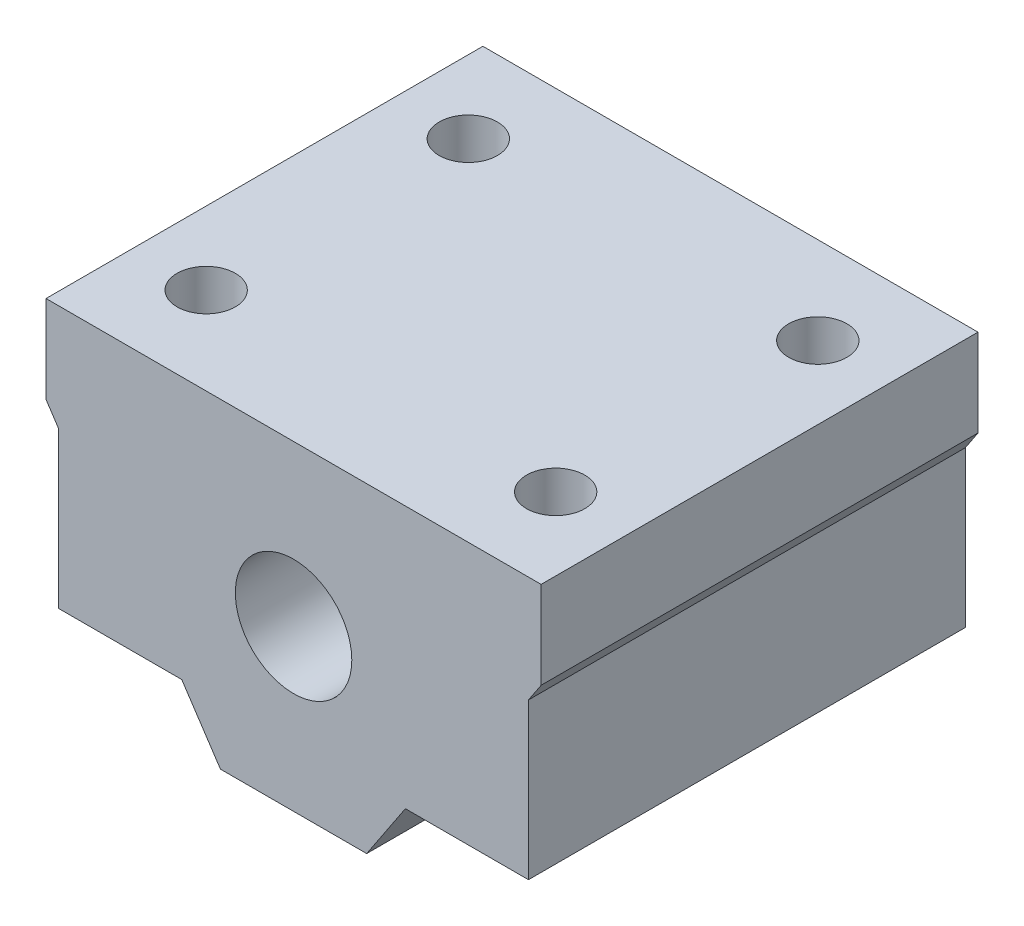
ISO-10303-21;
HEADER;
FILE_DESCRIPTION(('STEP AP214'),'2;1');
FILE_NAME('part.step','',(''),(''),'','','');
FILE_SCHEMA(('AUTOMOTIVE_DESIGN { 1 0 10303 214 1 1 1 1 }'));
ENDSEC;
DATA;
#1=APPLICATION_CONTEXT('core data for automotive mechanical design processes');
#2=APPLICATION_PROTOCOL_DEFINITION('international standard','automotive_design',2000,#1);
#3=PRODUCT_CONTEXT('',#1,'mechanical');
#4=PRODUCT('Part','Part','',(#3));
#5=PRODUCT_RELATED_PRODUCT_CATEGORY('part','',(#4));
#6=PRODUCT_DEFINITION_FORMATION('','',#4);
#7=PRODUCT_DEFINITION_CONTEXT('part definition',#1,'design');
#8=PRODUCT_DEFINITION('design','',#6,#7);
#9=PRODUCT_DEFINITION_SHAPE('','',#8);
#10=(LENGTH_UNIT() NAMED_UNIT(*) SI_UNIT(.MILLI.,.METRE.));
#11=(NAMED_UNIT(*) PLANE_ANGLE_UNIT() SI_UNIT($,.RADIAN.));
#12=(NAMED_UNIT(*) SI_UNIT($,.STERADIAN.) SOLID_ANGLE_UNIT());
#13=UNCERTAINTY_MEASURE_WITH_UNIT(LENGTH_MEASURE(1.E-05),#10,'distance_accuracy_value','');
#14=(GEOMETRIC_REPRESENTATION_CONTEXT(3) GLOBAL_UNCERTAINTY_ASSIGNED_CONTEXT((#13)) GLOBAL_UNIT_ASSIGNED_CONTEXT((#10,
#11,#12)) REPRESENTATION_CONTEXT('',''));
#15=CARTESIAN_POINT('',(0.,0.,0.));
#16=DIRECTION('',(0.,0.,1.));
#17=DIRECTION('',(1.,0.,0.));
#18=AXIS2_PLACEMENT_3D('',#15,#16,#17);
#19=CARTESIAN_POINT('',(0.,0.,30.));
#20=DIRECTION('',(0.,0.,1.));
#21=DIRECTION('',(1.,0.,0.));
#22=AXIS2_PLACEMENT_3D('',#19,#20,#21);
#23=PLANE('',#22);
#24=DIRECTION('',(0.553227534661274,0.833030188464145,0.));
#25=VECTOR('',#24,1.);
#26=CARTESIAN_POINT('',(7.67824556938152,-7.,30.));
#27=LINE('',#26,#25);
#28=CARTESIAN_POINT('',(5.02178705288402,-11.,30.));
#29=VERTEX_POINT('',#28);
#30=CARTESIAN_POINT('',(7.67824556938152,-7.,30.));
#31=VERTEX_POINT('',#30);
#32=EDGE_CURVE('E182',#29,#31,#27,.T.);
#33=ORIENTED_EDGE('',*,*,#32,.T.);
#34=DIRECTION('',(1.,0.,0.));
#35=VECTOR('',#34,1.);
#36=CARTESIAN_POINT('',(16.1308655391082,-7.,30.));
#37=LINE('',#36,#35);
#38=CARTESIAN_POINT('',(16.1308655391082,-7.,30.));
#39=VERTEX_POINT('',#38);
#40=EDGE_CURVE('E110',#31,#39,#37,.T.);
#41=ORIENTED_EDGE('',*,*,#40,.T.);
#42=DIRECTION('',(0.,1.,0.));
#43=VECTOR('',#42,1.);
#44=CARTESIAN_POINT('',(16.1308655391082,3.69128848729361,30.));
#45=LINE('',#44,#43);
#46=CARTESIAN_POINT('',(16.1308655391082,3.69128848729361,30.));
#47=VERTEX_POINT('',#46);
#48=EDGE_CURVE('E260',#39,#47,#45,.T.);
#49=ORIENTED_EDGE('',*,*,#48,.T.);
#50=DIRECTION('',(0.553227534661272,0.833030188464147,0.));
#51=VECTOR('',#50,1.);
#52=CARTESIAN_POINT('',(17.,5.,30.));
#53=LINE('',#52,#51);
#54=CARTESIAN_POINT('',(17.,5.,30.));
#55=VERTEX_POINT('',#54);
#56=EDGE_CURVE('E262',#47,#55,#53,.T.);
#57=ORIENTED_EDGE('',*,*,#56,.T.);
#58=DIRECTION('',(0.,1.,0.));
#59=VECTOR('',#58,1.);
#60=CARTESIAN_POINT('',(17.,11.,30.));
#61=LINE('',#60,#59);
#62=CARTESIAN_POINT('',(17.,11.,30.));
#63=VERTEX_POINT('',#62);
#64=EDGE_CURVE('E264',#55,#63,#61,.T.);
#65=ORIENTED_EDGE('',*,*,#64,.T.);
#66=DIRECTION('',(-1.,0.,0.));
#67=VECTOR('',#66,1.);
#68=CARTESIAN_POINT('',(17.,11.,30.));
#69=LINE('',#68,#67);
#70=CARTESIAN_POINT('',(-17.,11.,30.));
#71=VERTEX_POINT('',#70);
#72=EDGE_CURVE('E266',#63,#71,#69,.T.);
#73=ORIENTED_EDGE('',*,*,#72,.T.);
#74=DIRECTION('',(0.,-1.,0.));
#75=VECTOR('',#74,1.);
#76=CARTESIAN_POINT('',(-17.,11.,30.));
#77=LINE('',#76,#75);
#78=CARTESIAN_POINT('',(-17.,5.,30.));
#79=VERTEX_POINT('',#78);
#80=EDGE_CURVE('E268',#71,#79,#77,.T.);
#81=ORIENTED_EDGE('',*,*,#80,.T.);
#82=DIRECTION('',(0.553227534661274,-0.833030188464145,0.));
#83=VECTOR('',#82,1.);
#84=CARTESIAN_POINT('',(-17.,5.,30.));
#85=LINE('',#84,#83);
#86=CARTESIAN_POINT('',(-16.1308655391082,3.69128848729362,30.));
#87=VERTEX_POINT('',#86);
#88=EDGE_CURVE('E270',#79,#87,#85,.T.);
#89=ORIENTED_EDGE('',*,*,#88,.T.);
#90=DIRECTION('',(0.,-1.,0.));
#91=VECTOR('',#90,1.);
#92=CARTESIAN_POINT('',(-16.1308655391082,3.69128848729362,30.));
#93=LINE('',#92,#91);
#94=CARTESIAN_POINT('',(-16.1308655391082,-7.,30.));
#95=VERTEX_POINT('',#94);
#96=EDGE_CURVE('E141',#87,#95,#93,.T.);
#97=ORIENTED_EDGE('',*,*,#96,.T.);
#98=DIRECTION('',(1.,0.,0.));
#99=VECTOR('',#98,1.);
#100=CARTESIAN_POINT('',(-16.1308655391082,-7.,30.));
#101=LINE('',#100,#99);
#102=CARTESIAN_POINT('',(-7.67824556938152,-7.,30.));
#103=VERTEX_POINT('',#102);
#104=EDGE_CURVE('E135',#95,#103,#101,.T.);
#105=ORIENTED_EDGE('',*,*,#104,.T.);
#106=DIRECTION('',(0.553227534661274,-0.833030188464145,0.));
#107=VECTOR('',#106,1.);
#108=CARTESIAN_POINT('',(-7.67824556938152,-7.,30.));
#109=LINE('',#108,#107);
#110=CARTESIAN_POINT('',(-5.02178705288402,-11.,30.));
#111=VERTEX_POINT('',#110);
#112=EDGE_CURVE('E139',#103,#111,#109,.T.);
#113=ORIENTED_EDGE('',*,*,#112,.T.);
#114=DIRECTION('',(1.,0.,0.));
#115=VECTOR('',#114,1.);
#116=CARTESIAN_POINT('',(-5.02178705288402,-11.,30.));
#117=LINE('',#116,#115);
#118=EDGE_CURVE('E55',#111,#29,#117,.T.);
#119=ORIENTED_EDGE('',*,*,#118,.T.);
#120=EDGE_LOOP('',(#33,#41,#49,#57,#65,#73,#81,#89,#97,#105,#113,#119));
#121=FACE_BOUND('',#120,.T.);
#122=CARTESIAN_POINT('',(0.,0.,30.));
#123=DIRECTION('',(0.,0.,1.));
#124=DIRECTION('',(1.,0.,0.));
#125=AXIS2_PLACEMENT_3D('',#122,#123,#124);
#126=CIRCLE('',#125,4.);
#127=CARTESIAN_POINT('',(4.,0.,30.));
#128=VERTEX_POINT('',#127);
#129=EDGE_CURVE('E163',#128,#128,#126,.T.);
#130=ORIENTED_EDGE('',*,*,#129,.F.);
#131=EDGE_LOOP('',(#130));
#132=FACE_BOUND('',#131,.T.);
#133=ADVANCED_FACE('F36',(#121,#132),#23,.T.);
#134=CARTESIAN_POINT('',(0.,0.,0.));
#135=DIRECTION('',(0.,0.,1.));
#136=DIRECTION('',(1.,0.,0.));
#137=AXIS2_PLACEMENT_3D('',#134,#135,#136);
#138=PLANE('',#137);
#139=DIRECTION('',(0.553227534661274,0.833030188464145,0.));
#140=VECTOR('',#139,1.);
#141=CARTESIAN_POINT('',(7.67824556938152,-7.,0.));
#142=LINE('',#141,#140);
#143=CARTESIAN_POINT('',(5.02178705288402,-11.,0.));
#144=VERTEX_POINT('',#143);
#145=CARTESIAN_POINT('',(7.67824556938152,-7.,0.));
#146=VERTEX_POINT('',#145);
#147=EDGE_CURVE('E159',#144,#146,#142,.T.);
#148=ORIENTED_EDGE('',*,*,#147,.F.);
#149=DIRECTION('',(1.,0.,0.));
#150=VECTOR('',#149,1.);
#151=CARTESIAN_POINT('',(-5.02178705288402,-11.,0.));
#152=LINE('',#151,#150);
#153=CARTESIAN_POINT('',(-5.02178705288402,-11.,0.));
#154=VERTEX_POINT('',#153);
#155=EDGE_CURVE('E102',#154,#144,#152,.T.);
#156=ORIENTED_EDGE('',*,*,#155,.F.);
#157=DIRECTION('',(0.553227534661274,-0.833030188464145,0.));
#158=VECTOR('',#157,1.);
#159=CARTESIAN_POINT('',(-7.67824556938152,-7.,0.));
#160=LINE('',#159,#158);
#161=CARTESIAN_POINT('',(-7.67824556938152,-7.,0.));
#162=VERTEX_POINT('',#161);
#163=EDGE_CURVE('E96',#162,#154,#160,.T.);
#164=ORIENTED_EDGE('',*,*,#163,.F.);
#165=DIRECTION('',(1.,0.,0.));
#166=VECTOR('',#165,1.);
#167=CARTESIAN_POINT('',(-16.1308655391082,-7.,0.));
#168=LINE('',#167,#166);
#169=CARTESIAN_POINT('',(-16.1308655391082,-7.,0.));
#170=VERTEX_POINT('',#169);
#171=EDGE_CURVE('E149',#170,#162,#168,.T.);
#172=ORIENTED_EDGE('',*,*,#171,.F.);
#173=DIRECTION('',(0.,-1.,0.));
#174=VECTOR('',#173,1.);
#175=CARTESIAN_POINT('',(-16.1308655391082,3.69128848729362,0.));
#176=LINE('',#175,#174);
#177=CARTESIAN_POINT('',(-16.1308655391082,3.69128848729362,0.));
#178=VERTEX_POINT('',#177);
#179=EDGE_CURVE('E177',#178,#170,#176,.T.);
#180=ORIENTED_EDGE('',*,*,#179,.F.);
#181=DIRECTION('',(0.553227534661274,-0.833030188464145,0.));
#182=VECTOR('',#181,1.);
#183=CARTESIAN_POINT('',(-17.,5.,0.));
#184=LINE('',#183,#182);
#185=CARTESIAN_POINT('',(-17.,5.,0.));
#186=VERTEX_POINT('',#185);
#187=EDGE_CURVE('E175',#186,#178,#184,.T.);
#188=ORIENTED_EDGE('',*,*,#187,.F.);
#189=DIRECTION('',(0.,-1.,0.));
#190=VECTOR('',#189,1.);
#191=CARTESIAN_POINT('',(-17.,11.,0.));
#192=LINE('',#191,#190);
#193=CARTESIAN_POINT('',(-17.,11.,0.));
#194=VERTEX_POINT('',#193);
#195=EDGE_CURVE('E173',#194,#186,#192,.T.);
#196=ORIENTED_EDGE('',*,*,#195,.F.);
#197=DIRECTION('',(-1.,0.,0.));
#198=VECTOR('',#197,1.);
#199=CARTESIAN_POINT('',(17.,11.,0.));
#200=LINE('',#199,#198);
#201=CARTESIAN_POINT('',(17.,11.,0.));
#202=VERTEX_POINT('',#201);
#203=EDGE_CURVE('E171',#202,#194,#200,.T.);
#204=ORIENTED_EDGE('',*,*,#203,.F.);
#205=DIRECTION('',(0.,1.,0.));
#206=VECTOR('',#205,1.);
#207=CARTESIAN_POINT('',(17.,11.,0.));
#208=LINE('',#207,#206);
#209=CARTESIAN_POINT('',(17.,5.,0.));
#210=VERTEX_POINT('',#209);
#211=EDGE_CURVE('E169',#210,#202,#208,.T.);
#212=ORIENTED_EDGE('',*,*,#211,.F.);
#213=DIRECTION('',(0.553227534661272,0.833030188464147,0.));
#214=VECTOR('',#213,1.);
#215=CARTESIAN_POINT('',(17.,5.,0.));
#216=LINE('',#215,#214);
#217=CARTESIAN_POINT('',(16.1308655391082,3.69128848729361,0.));
#218=VERTEX_POINT('',#217);
#219=EDGE_CURVE('E167',#218,#210,#216,.T.);
#220=ORIENTED_EDGE('',*,*,#219,.F.);
#221=DIRECTION('',(0.,1.,0.));
#222=VECTOR('',#221,1.);
#223=CARTESIAN_POINT('',(16.1308655391082,3.69128848729361,0.));
#224=LINE('',#223,#222);
#225=CARTESIAN_POINT('',(16.1308655391082,-7.,0.));
#226=VERTEX_POINT('',#225);
#227=EDGE_CURVE('E165',#226,#218,#224,.T.);
#228=ORIENTED_EDGE('',*,*,#227,.F.);
#229=DIRECTION('',(1.,0.,0.));
#230=VECTOR('',#229,1.);
#231=CARTESIAN_POINT('',(16.1308655391082,-7.,0.));
#232=LINE('',#231,#230);
#233=EDGE_CURVE('E162',#146,#226,#232,.T.);
#234=ORIENTED_EDGE('',*,*,#233,.F.);
#235=EDGE_LOOP('',(#148,#156,#164,#172,#180,#188,#196,#204,#212,#220,#228,#234));
#236=FACE_BOUND('',#235,.T.);
#237=CARTESIAN_POINT('',(0.,0.,0.));
#238=DIRECTION('',(0.,0.,1.));
#239=DIRECTION('',(1.,0.,0.));
#240=AXIS2_PLACEMENT_3D('',#237,#238,#239);
#241=CIRCLE('',#240,4.);
#242=CARTESIAN_POINT('',(4.,0.,0.));
#243=VERTEX_POINT('',#242);
#244=EDGE_CURVE('E251',#243,#243,#241,.T.);
#245=ORIENTED_EDGE('',*,*,#244,.T.);
#246=EDGE_LOOP('',(#245));
#247=FACE_BOUND('',#246,.T.);
#248=ADVANCED_FACE('F283',(#236,#247),#138,.F.);
#249=CARTESIAN_POINT('',(7.67824556938152,-7.,30.));
#250=DIRECTION('',(-0.833030188464145,0.553227534661274,0.));
#251=DIRECTION('',(-0.553227534661274,-0.833030188464145,0.));
#252=AXIS2_PLACEMENT_3D('',#249,#250,#251);
#253=PLANE('',#252);
#254=ORIENTED_EDGE('',*,*,#147,.T.);
#255=DIRECTION('',(0.,0.,-1.));
#256=VECTOR('',#255,1.);
#257=CARTESIAN_POINT('',(7.67824556938152,-7.,30.));
#258=LINE('',#257,#256);
#259=EDGE_CURVE('E11',#31,#146,#258,.T.);
#260=ORIENTED_EDGE('',*,*,#259,.F.);
#261=ORIENTED_EDGE('',*,*,#32,.F.);
#262=DIRECTION('',(0.,0.,-1.));
#263=VECTOR('',#262,1.);
#264=CARTESIAN_POINT('',(5.02178705288402,-11.,30.));
#265=LINE('',#264,#263);
#266=EDGE_CURVE('E155',#29,#144,#265,.T.);
#267=ORIENTED_EDGE('',*,*,#266,.T.);
#268=EDGE_LOOP('',(#254,#260,#261,#267));
#269=FACE_BOUND('',#268,.T.);
#270=ADVANCED_FACE('F38',(#269),#253,.F.);
#271=CARTESIAN_POINT('',(16.1308655391082,-7.,30.));
#272=DIRECTION('',(0.,1.,0.));
#273=DIRECTION('',(0.,0.,1.));
#274=AXIS2_PLACEMENT_3D('',#271,#272,#273);
#275=PLANE('',#274);
#276=CARTESIAN_POINT('',(12.,-7.,6.));
#277=DIRECTION('',(0.,1.,0.));
#278=DIRECTION('',(0.,0.,1.));
#279=AXIS2_PLACEMENT_3D('',#276,#277,#278);
#280=CIRCLE('',#279,1.7);
#281=CARTESIAN_POINT('',(12.,-7.,7.7));
#282=VERTEX_POINT('',#281);
#283=EDGE_CURVE('E212',#282,#282,#280,.T.);
#284=ORIENTED_EDGE('',*,*,#283,.T.);
#285=EDGE_LOOP('',(#284));
#286=FACE_BOUND('',#285,.T.);
#287=CARTESIAN_POINT('',(12.,-7.,24.));
#288=DIRECTION('',(0.,1.,0.));
#289=DIRECTION('',(0.,0.,1.));
#290=AXIS2_PLACEMENT_3D('',#287,#288,#289);
#291=CIRCLE('',#290,1.7);
#292=CARTESIAN_POINT('',(12.,-7.,25.7));
#293=VERTEX_POINT('',#292);
#294=EDGE_CURVE('E209',#293,#293,#291,.T.);
#295=ORIENTED_EDGE('',*,*,#294,.T.);
#296=EDGE_LOOP('',(#295));
#297=FACE_BOUND('',#296,.T.);
#298=ORIENTED_EDGE('',*,*,#233,.T.);
#299=DIRECTION('',(0.,0.,-1.));
#300=VECTOR('',#299,1.);
#301=CARTESIAN_POINT('',(16.1308655391082,-7.,30.));
#302=LINE('',#301,#300);
#303=EDGE_CURVE('E46',#39,#226,#302,.T.);
#304=ORIENTED_EDGE('',*,*,#303,.F.);
#305=ORIENTED_EDGE('',*,*,#40,.F.);
#306=ORIENTED_EDGE('',*,*,#259,.T.);
#307=EDGE_LOOP('',(#298,#304,#305,#306));
#308=FACE_BOUND('',#307,.T.);
#309=ADVANCED_FACE('F360',(#286,#297,#308),#275,.F.);
#310=CARTESIAN_POINT('',(16.1308655391082,3.69128848729361,30.));
#311=DIRECTION('',(-1.,0.,0.));
#312=DIRECTION('',(0.,-1.,0.));
#313=AXIS2_PLACEMENT_3D('',#310,#311,#312);
#314=PLANE('',#313);
#315=ORIENTED_EDGE('',*,*,#227,.T.);
#316=DIRECTION('',(0.,0.,-1.));
#317=VECTOR('',#316,1.);
#318=CARTESIAN_POINT('',(16.1308655391082,3.69128848729361,30.));
#319=LINE('',#318,#317);
#320=EDGE_CURVE('E201',#47,#218,#319,.T.);
#321=ORIENTED_EDGE('',*,*,#320,.F.);
#322=ORIENTED_EDGE('',*,*,#48,.F.);
#323=ORIENTED_EDGE('',*,*,#303,.T.);
#324=EDGE_LOOP('',(#315,#321,#322,#323));
#325=FACE_BOUND('',#324,.T.);
#326=ADVANCED_FACE('F362',(#325),#314,.F.);
#327=CARTESIAN_POINT('',(17.,5.,30.));
#328=DIRECTION('',(-0.833030188464147,0.553227534661272,0.));
#329=DIRECTION('',(-0.553227534661272,-0.833030188464147,0.));
#330=AXIS2_PLACEMENT_3D('',#327,#328,#329);
#331=PLANE('',#330);
#332=ORIENTED_EDGE('',*,*,#219,.T.);
#333=DIRECTION('',(0.,0.,-1.));
#334=VECTOR('',#333,1.);
#335=CARTESIAN_POINT('',(17.,5.,30.));
#336=LINE('',#335,#334);
#337=EDGE_CURVE('E198',#55,#210,#336,.T.);
#338=ORIENTED_EDGE('',*,*,#337,.F.);
#339=ORIENTED_EDGE('',*,*,#56,.F.);
#340=ORIENTED_EDGE('',*,*,#320,.T.);
#341=EDGE_LOOP('',(#332,#338,#339,#340));
#342=FACE_BOUND('',#341,.T.);
#343=ADVANCED_FACE('F371',(#342),#331,.F.);
#344=CARTESIAN_POINT('',(17.,11.,30.));
#345=DIRECTION('',(-1.,0.,0.));
#346=DIRECTION('',(0.,0.,1.));
#347=AXIS2_PLACEMENT_3D('',#344,#345,#346);
#348=PLANE('',#347);
#349=ORIENTED_EDGE('',*,*,#211,.T.);
#350=DIRECTION('',(0.,0.,-1.));
#351=VECTOR('',#350,1.);
#352=CARTESIAN_POINT('',(17.,11.,30.));
#353=LINE('',#352,#351);
#354=EDGE_CURVE('E195',#63,#202,#353,.T.);
#355=ORIENTED_EDGE('',*,*,#354,.F.);
#356=ORIENTED_EDGE('',*,*,#64,.F.);
#357=ORIENTED_EDGE('',*,*,#337,.T.);
#358=EDGE_LOOP('',(#349,#355,#356,#357));
#359=FACE_BOUND('',#358,.T.);
#360=ADVANCED_FACE('F375',(#359),#348,.F.);
#361=CARTESIAN_POINT('',(17.,11.,30.));
#362=DIRECTION('',(0.,-1.,0.));
#363=DIRECTION('',(0.,0.,-1.));
#364=AXIS2_PLACEMENT_3D('',#361,#362,#363);
#365=PLANE('',#364);
#366=CARTESIAN_POINT('',(12.,11.,24.));
#367=DIRECTION('',(0.,1.,0.));
#368=DIRECTION('',(0.,0.,1.));
#369=AXIS2_PLACEMENT_3D('',#366,#367,#368);
#370=CIRCLE('',#369,2.);
#371=CARTESIAN_POINT('',(12.,11.,26.));
#372=VERTEX_POINT('',#371);
#373=EDGE_CURVE('E229',#372,#372,#370,.T.);
#374=ORIENTED_EDGE('',*,*,#373,.F.);
#375=EDGE_LOOP('',(#374));
#376=FACE_BOUND('',#375,.T.);
#377=CARTESIAN_POINT('',(12.,11.,6.));
#378=DIRECTION('',(0.,1.,0.));
#379=DIRECTION('',(0.,0.,1.));
#380=AXIS2_PLACEMENT_3D('',#377,#378,#379);
#381=CIRCLE('',#380,2.);
#382=CARTESIAN_POINT('',(12.,11.,8.));
#383=VERTEX_POINT('',#382);
#384=EDGE_CURVE('E240',#383,#383,#381,.T.);
#385=ORIENTED_EDGE('',*,*,#384,.F.);
#386=EDGE_LOOP('',(#385));
#387=FACE_BOUND('',#386,.T.);
#388=CARTESIAN_POINT('',(-12.,11.,6.));
#389=DIRECTION('',(0.,1.,0.));
#390=DIRECTION('',(0.,0.,1.));
#391=AXIS2_PLACEMENT_3D('',#388,#389,#390);
#392=CIRCLE('',#391,2.);
#393=CARTESIAN_POINT('',(-12.,11.,8.));
#394=VERTEX_POINT('',#393);
#395=EDGE_CURVE('E234',#394,#394,#392,.T.);
#396=ORIENTED_EDGE('',*,*,#395,.F.);
#397=EDGE_LOOP('',(#396));
#398=FACE_BOUND('',#397,.T.);
#399=CARTESIAN_POINT('',(-12.,11.,24.));
#400=DIRECTION('',(0.,1.,0.));
#401=DIRECTION('',(0.,0.,1.));
#402=AXIS2_PLACEMENT_3D('',#399,#400,#401);
#403=CIRCLE('',#402,2.);
#404=CARTESIAN_POINT('',(-12.,11.,26.));
#405=VERTEX_POINT('',#404);
#406=EDGE_CURVE('E233',#405,#405,#403,.T.);
#407=ORIENTED_EDGE('',*,*,#406,.F.);
#408=EDGE_LOOP('',(#407));
#409=FACE_BOUND('',#408,.T.);
#410=ORIENTED_EDGE('',*,*,#203,.T.);
#411=DIRECTION('',(0.,0.,-1.));
#412=VECTOR('',#411,1.);
#413=CARTESIAN_POINT('',(-17.,11.,30.));
#414=LINE('',#413,#412);
#415=EDGE_CURVE('E192',#71,#194,#414,.T.);
#416=ORIENTED_EDGE('',*,*,#415,.F.);
#417=ORIENTED_EDGE('',*,*,#72,.F.);
#418=ORIENTED_EDGE('',*,*,#354,.T.);
#419=EDGE_LOOP('',(#410,#416,#417,#418));
#420=FACE_BOUND('',#419,.T.);
#421=ADVANCED_FACE('F380',(#376,#387,#398,#409,#420),#365,.F.);
#422=CARTESIAN_POINT('',(-17.,11.,30.));
#423=DIRECTION('',(1.,0.,0.));
#424=DIRECTION('',(0.,0.,-1.));
#425=AXIS2_PLACEMENT_3D('',#422,#423,#424);
#426=PLANE('',#425);
#427=ORIENTED_EDGE('',*,*,#195,.T.);
#428=DIRECTION('',(0.,0.,-1.));
#429=VECTOR('',#428,1.);
#430=CARTESIAN_POINT('',(-17.,5.,30.));
#431=LINE('',#430,#429);
#432=EDGE_CURVE('E189',#79,#186,#431,.T.);
#433=ORIENTED_EDGE('',*,*,#432,.F.);
#434=ORIENTED_EDGE('',*,*,#80,.F.);
#435=ORIENTED_EDGE('',*,*,#415,.T.);
#436=EDGE_LOOP('',(#427,#433,#434,#435));
#437=FACE_BOUND('',#436,.T.);
#438=ADVANCED_FACE('F383',(#437),#426,.F.);
#439=CARTESIAN_POINT('',(-17.,5.,30.));
#440=DIRECTION('',(0.833030188464145,0.553227534661274,0.));
#441=DIRECTION('',(-0.553227534661274,0.833030188464145,0.));
#442=AXIS2_PLACEMENT_3D('',#439,#440,#441);
#443=PLANE('',#442);
#444=ORIENTED_EDGE('',*,*,#187,.T.);
#445=DIRECTION('',(0.,0.,-1.));
#446=VECTOR('',#445,1.);
#447=CARTESIAN_POINT('',(-16.1308655391082,3.69128848729362,30.));
#448=LINE('',#447,#446);
#449=EDGE_CURVE('E186',#87,#178,#448,.T.);
#450=ORIENTED_EDGE('',*,*,#449,.F.);
#451=ORIENTED_EDGE('',*,*,#88,.F.);
#452=ORIENTED_EDGE('',*,*,#432,.T.);
#453=EDGE_LOOP('',(#444,#450,#451,#452));
#454=FACE_BOUND('',#453,.T.);
#455=ADVANCED_FACE('F276',(#454),#443,.F.);
#456=CARTESIAN_POINT('',(-16.1308655391082,3.69128848729362,30.));
#457=DIRECTION('',(1.,0.,0.));
#458=DIRECTION('',(0.,0.,-1.));
#459=AXIS2_PLACEMENT_3D('',#456,#457,#458);
#460=PLANE('',#459);
#461=ORIENTED_EDGE('',*,*,#179,.T.);
#462=DIRECTION('',(0.,0.,-1.));
#463=VECTOR('',#462,1.);
#464=CARTESIAN_POINT('',(-16.1308655391082,-7.,30.));
#465=LINE('',#464,#463);
#466=EDGE_CURVE('E150',#95,#170,#465,.T.);
#467=ORIENTED_EDGE('',*,*,#466,.F.);
#468=ORIENTED_EDGE('',*,*,#96,.F.);
#469=ORIENTED_EDGE('',*,*,#449,.T.);
#470=EDGE_LOOP('',(#461,#467,#468,#469));
#471=FACE_BOUND('',#470,.T.);
#472=ADVANCED_FACE('F280',(#471),#460,.F.);
#473=CARTESIAN_POINT('',(-16.1308655391082,-7.,30.));
#474=DIRECTION('',(0.,1.,0.));
#475=DIRECTION('',(0.,0.,1.));
#476=AXIS2_PLACEMENT_3D('',#473,#474,#475);
#477=PLANE('',#476);
#478=CARTESIAN_POINT('',(-12.,-7.,24.));
#479=DIRECTION('',(0.,1.,0.));
#480=DIRECTION('',(0.,0.,1.));
#481=AXIS2_PLACEMENT_3D('',#478,#479,#480);
#482=CIRCLE('',#481,1.7);
#483=CARTESIAN_POINT('',(-12.,-7.,25.7));
#484=VERTEX_POINT('',#483);
#485=EDGE_CURVE('E226',#484,#484,#482,.T.);
#486=ORIENTED_EDGE('',*,*,#485,.T.);
#487=EDGE_LOOP('',(#486));
#488=FACE_BOUND('',#487,.T.);
#489=CARTESIAN_POINT('',(-12.,-7.,6.));
#490=DIRECTION('',(0.,1.,0.));
#491=DIRECTION('',(0.,0.,1.));
#492=AXIS2_PLACEMENT_3D('',#489,#490,#491);
#493=CIRCLE('',#492,1.7);
#494=CARTESIAN_POINT('',(-12.,-7.,7.7));
#495=VERTEX_POINT('',#494);
#496=EDGE_CURVE('E215',#495,#495,#493,.T.);
#497=ORIENTED_EDGE('',*,*,#496,.T.);
#498=EDGE_LOOP('',(#497));
#499=FACE_BOUND('',#498,.T.);
#500=ORIENTED_EDGE('',*,*,#171,.T.);
#501=DIRECTION('',(0.,0.,-1.));
#502=VECTOR('',#501,1.);
#503=CARTESIAN_POINT('',(-7.67824556938152,-7.,30.));
#504=LINE('',#503,#502);
#505=EDGE_CURVE('E146',#103,#162,#504,.T.);
#506=ORIENTED_EDGE('',*,*,#505,.F.);
#507=ORIENTED_EDGE('',*,*,#104,.F.);
#508=ORIENTED_EDGE('',*,*,#466,.T.);
#509=EDGE_LOOP('',(#500,#506,#507,#508));
#510=FACE_BOUND('',#509,.T.);
#511=ADVANCED_FACE('F147',(#488,#499,#510),#477,.F.);
#512=CARTESIAN_POINT('',(-7.67824556938152,-7.,30.));
#513=DIRECTION('',(0.833030188464145,0.553227534661274,0.));
#514=DIRECTION('',(-0.553227534661274,0.833030188464145,0.));
#515=AXIS2_PLACEMENT_3D('',#512,#513,#514);
#516=PLANE('',#515);
#517=ORIENTED_EDGE('',*,*,#163,.T.);
#518=DIRECTION('',(0.,0.,-1.));
#519=VECTOR('',#518,1.);
#520=CARTESIAN_POINT('',(-5.02178705288402,-11.,30.));
#521=LINE('',#520,#519);
#522=EDGE_CURVE('E151',#111,#154,#521,.T.);
#523=ORIENTED_EDGE('',*,*,#522,.F.);
#524=ORIENTED_EDGE('',*,*,#112,.F.);
#525=ORIENTED_EDGE('',*,*,#505,.T.);
#526=EDGE_LOOP('',(#517,#523,#524,#525));
#527=FACE_BOUND('',#526,.T.);
#528=ADVANCED_FACE('F153',(#527),#516,.F.);
#529=CARTESIAN_POINT('',(-5.02178705288402,-11.,30.));
#530=DIRECTION('',(0.,1.,0.));
#531=DIRECTION('',(0.,0.,1.));
#532=AXIS2_PLACEMENT_3D('',#529,#530,#531);
#533=PLANE('',#532);
#534=ORIENTED_EDGE('',*,*,#155,.T.);
#535=ORIENTED_EDGE('',*,*,#266,.F.);
#536=ORIENTED_EDGE('',*,*,#118,.F.);
#537=ORIENTED_EDGE('',*,*,#522,.T.);
#538=EDGE_LOOP('',(#534,#535,#536,#537));
#539=FACE_BOUND('',#538,.T.);
#540=ADVANCED_FACE('F289',(#539),#533,.F.);
#541=CARTESIAN_POINT('',(0.,0.,30.));
#542=DIRECTION('',(0.,0.,-1.));
#543=DIRECTION('',(-1.,0.,0.));
#544=AXIS2_PLACEMENT_3D('',#541,#542,#543);
#545=CYLINDRICAL_SURFACE('',#544,4.);
#546=ORIENTED_EDGE('',*,*,#129,.T.);
#547=EDGE_LOOP('',(#546));
#548=FACE_BOUND('',#547,.T.);
#549=ORIENTED_EDGE('',*,*,#244,.F.);
#550=EDGE_LOOP('',(#549));
#551=FACE_BOUND('',#550,.T.);
#552=ADVANCED_FACE('F291',(#548,#551),#545,.F.);
#553=CARTESIAN_POINT('',(-12.,3.,24.));
#554=DIRECTION('',(0.,1.,0.));
#555=DIRECTION('',(0.,0.,1.));
#556=AXIS2_PLACEMENT_3D('',#553,#554,#555);
#557=CYLINDRICAL_SURFACE('',#556,2.);
#558=CARTESIAN_POINT('',(-12.,3.,24.));
#559=DIRECTION('',(0.,1.,0.));
#560=DIRECTION('',(0.,0.,1.));
#561=AXIS2_PLACEMENT_3D('',#558,#559,#560);
#562=CIRCLE('',#561,2.);
#563=CARTESIAN_POINT('',(-12.,3.,26.));
#564=VERTEX_POINT('',#563);
#565=EDGE_CURVE('E248',#564,#564,#562,.T.);
#566=ORIENTED_EDGE('',*,*,#565,.F.);
#567=EDGE_LOOP('',(#566));
#568=FACE_BOUND('',#567,.T.);
#569=ORIENTED_EDGE('',*,*,#406,.T.);
#570=EDGE_LOOP('',(#569));
#571=FACE_BOUND('',#570,.T.);
#572=ADVANCED_FACE('F297',(#568,#571),#557,.F.);
#573=CARTESIAN_POINT('',(-12.,3.,24.));
#574=DIRECTION('',(0.,1.,0.));
#575=DIRECTION('',(0.,0.,1.));
#576=AXIS2_PLACEMENT_3D('',#573,#574,#575);
#577=PLANE('',#576);
#578=CARTESIAN_POINT('',(-12.,3.,24.));
#579=DIRECTION('',(0.,1.,0.));
#580=DIRECTION('',(0.,0.,1.));
#581=AXIS2_PLACEMENT_3D('',#578,#579,#580);
#582=CIRCLE('',#581,1.7);
#583=CARTESIAN_POINT('',(-12.,3.,25.7));
#584=VERTEX_POINT('',#583);
#585=EDGE_CURVE('E40',#584,#584,#582,.T.);
#586=ORIENTED_EDGE('',*,*,#585,.F.);
#587=EDGE_LOOP('',(#586));
#588=FACE_BOUND('',#587,.T.);
#589=ORIENTED_EDGE('',*,*,#565,.T.);
#590=EDGE_LOOP('',(#589));
#591=FACE_BOUND('',#590,.T.);
#592=ADVANCED_FACE('F310',(#588,#591),#577,.T.);
#593=CARTESIAN_POINT('',(-12.,3.,6.));
#594=DIRECTION('',(0.,1.,0.));
#595=DIRECTION('',(0.,0.,1.));
#596=AXIS2_PLACEMENT_3D('',#593,#594,#595);
#597=CYLINDRICAL_SURFACE('',#596,2.);
#598=CARTESIAN_POINT('',(-12.,3.,6.));
#599=DIRECTION('',(0.,1.,0.));
#600=DIRECTION('',(0.,0.,1.));
#601=AXIS2_PLACEMENT_3D('',#598,#599,#600);
#602=CIRCLE('',#601,2.);
#603=CARTESIAN_POINT('',(-12.,3.,8.));
#604=VERTEX_POINT('',#603);
#605=EDGE_CURVE('E230',#604,#604,#602,.T.);
#606=ORIENTED_EDGE('',*,*,#605,.F.);
#607=EDGE_LOOP('',(#606));
#608=FACE_BOUND('',#607,.T.);
#609=ORIENTED_EDGE('',*,*,#395,.T.);
#610=EDGE_LOOP('',(#609));
#611=FACE_BOUND('',#610,.T.);
#612=ADVANCED_FACE('F314',(#608,#611),#597,.F.);
#613=CARTESIAN_POINT('',(-12.,3.,6.));
#614=DIRECTION('',(0.,1.,0.));
#615=DIRECTION('',(0.,0.,1.));
#616=AXIS2_PLACEMENT_3D('',#613,#614,#615);
#617=PLANE('',#616);
#618=CARTESIAN_POINT('',(-12.,3.,6.));
#619=DIRECTION('',(0.,1.,0.));
#620=DIRECTION('',(0.,0.,1.));
#621=AXIS2_PLACEMENT_3D('',#618,#619,#620);
#622=CIRCLE('',#621,1.7);
#623=CARTESIAN_POINT('',(-12.,3.,7.7));
#624=VERTEX_POINT('',#623);
#625=EDGE_CURVE('E213',#624,#624,#622,.T.);
#626=ORIENTED_EDGE('',*,*,#625,.F.);
#627=EDGE_LOOP('',(#626));
#628=FACE_BOUND('',#627,.T.);
#629=ORIENTED_EDGE('',*,*,#605,.T.);
#630=EDGE_LOOP('',(#629));
#631=FACE_BOUND('',#630,.T.);
#632=ADVANCED_FACE('F329',(#628,#631),#617,.T.);
#633=CARTESIAN_POINT('',(12.,3.,6.));
#634=DIRECTION('',(0.,1.,0.));
#635=DIRECTION('',(0.,0.,1.));
#636=AXIS2_PLACEMENT_3D('',#633,#634,#635);
#637=CYLINDRICAL_SURFACE('',#636,2.);
#638=CARTESIAN_POINT('',(12.,3.,6.));
#639=DIRECTION('',(0.,1.,0.));
#640=DIRECTION('',(0.,0.,1.));
#641=AXIS2_PLACEMENT_3D('',#638,#639,#640);
#642=CIRCLE('',#641,2.);
#643=CARTESIAN_POINT('',(12.,3.,8.));
#644=VERTEX_POINT('',#643);
#645=EDGE_CURVE('E237',#644,#644,#642,.T.);
#646=ORIENTED_EDGE('',*,*,#645,.F.);
#647=EDGE_LOOP('',(#646));
#648=FACE_BOUND('',#647,.T.);
#649=ORIENTED_EDGE('',*,*,#384,.T.);
#650=EDGE_LOOP('',(#649));
#651=FACE_BOUND('',#650,.T.);
#652=ADVANCED_FACE('F326',(#648,#651),#637,.F.);
#653=CARTESIAN_POINT('',(12.,3.,6.));
#654=DIRECTION('',(0.,1.,0.));
#655=DIRECTION('',(0.,0.,1.));
#656=AXIS2_PLACEMENT_3D('',#653,#654,#655);
#657=PLANE('',#656);
#658=CARTESIAN_POINT('',(12.,3.,6.));
#659=DIRECTION('',(0.,1.,0.));
#660=DIRECTION('',(0.,0.,1.));
#661=AXIS2_PLACEMENT_3D('',#658,#659,#660);
#662=CIRCLE('',#661,1.7);
#663=CARTESIAN_POINT('',(12.,3.,7.7));
#664=VERTEX_POINT('',#663);
#665=EDGE_CURVE('E210',#664,#664,#662,.T.);
#666=ORIENTED_EDGE('',*,*,#665,.F.);
#667=EDGE_LOOP('',(#666));
#668=FACE_BOUND('',#667,.T.);
#669=ORIENTED_EDGE('',*,*,#645,.T.);
#670=EDGE_LOOP('',(#669));
#671=FACE_BOUND('',#670,.T.);
#672=ADVANCED_FACE('F320',(#668,#671),#657,.T.);
#673=CARTESIAN_POINT('',(12.,3.,24.));
#674=DIRECTION('',(0.,1.,0.));
#675=DIRECTION('',(0.,0.,1.));
#676=AXIS2_PLACEMENT_3D('',#673,#674,#675);
#677=CYLINDRICAL_SURFACE('',#676,2.);
#678=CARTESIAN_POINT('',(12.,3.,24.));
#679=DIRECTION('',(0.,1.,0.));
#680=DIRECTION('',(0.,0.,1.));
#681=AXIS2_PLACEMENT_3D('',#678,#679,#680);
#682=CIRCLE('',#681,2.);
#683=CARTESIAN_POINT('',(12.,3.,26.));
#684=VERTEX_POINT('',#683);
#685=EDGE_CURVE('E243',#684,#684,#682,.T.);
#686=ORIENTED_EDGE('',*,*,#685,.F.);
#687=EDGE_LOOP('',(#686));
#688=FACE_BOUND('',#687,.T.);
#689=ORIENTED_EDGE('',*,*,#373,.T.);
#690=EDGE_LOOP('',(#689));
#691=FACE_BOUND('',#690,.T.);
#692=ADVANCED_FACE('F316',(#688,#691),#677,.F.);
#693=CARTESIAN_POINT('',(12.,3.,24.));
#694=DIRECTION('',(0.,1.,0.));
#695=DIRECTION('',(0.,0.,1.));
#696=AXIS2_PLACEMENT_3D('',#693,#694,#695);
#697=PLANE('',#696);
#698=CARTESIAN_POINT('',(12.,3.,24.));
#699=DIRECTION('',(0.,1.,0.));
#700=DIRECTION('',(0.,0.,1.));
#701=AXIS2_PLACEMENT_3D('',#698,#699,#700);
#702=CIRCLE('',#701,1.7);
#703=CARTESIAN_POINT('',(12.,3.,25.7));
#704=VERTEX_POINT('',#703);
#705=EDGE_CURVE('E206',#704,#704,#702,.T.);
#706=ORIENTED_EDGE('',*,*,#705,.F.);
#707=EDGE_LOOP('',(#706));
#708=FACE_BOUND('',#707,.T.);
#709=ORIENTED_EDGE('',*,*,#685,.T.);
#710=EDGE_LOOP('',(#709));
#711=FACE_BOUND('',#710,.T.);
#712=ADVANCED_FACE('F319',(#708,#711),#697,.T.);
#713=CARTESIAN_POINT('',(12.,-11.,24.));
#714=DIRECTION('',(0.,1.,0.));
#715=DIRECTION('',(0.,0.,1.));
#716=AXIS2_PLACEMENT_3D('',#713,#714,#715);
#717=CYLINDRICAL_SURFACE('',#716,1.7);
#718=ORIENTED_EDGE('',*,*,#705,.T.);
#719=EDGE_LOOP('',(#718));
#720=FACE_BOUND('',#719,.T.);
#721=ORIENTED_EDGE('',*,*,#294,.F.);
#722=EDGE_LOOP('',(#721));
#723=FACE_BOUND('',#722,.T.);
#724=ADVANCED_FACE('F324',(#720,#723),#717,.F.);
#725=CARTESIAN_POINT('',(12.,-11.,6.));
#726=DIRECTION('',(0.,1.,0.));
#727=DIRECTION('',(0.,0.,1.));
#728=AXIS2_PLACEMENT_3D('',#725,#726,#727);
#729=CYLINDRICAL_SURFACE('',#728,1.7);
#730=ORIENTED_EDGE('',*,*,#665,.T.);
#731=EDGE_LOOP('',(#730));
#732=FACE_BOUND('',#731,.T.);
#733=ORIENTED_EDGE('',*,*,#283,.F.);
#734=EDGE_LOOP('',(#733));
#735=FACE_BOUND('',#734,.T.);
#736=ADVANCED_FACE('F344',(#732,#735),#729,.F.);
#737=CARTESIAN_POINT('',(-12.,-11.,6.));
#738=DIRECTION('',(0.,1.,0.));
#739=DIRECTION('',(0.,0.,1.));
#740=AXIS2_PLACEMENT_3D('',#737,#738,#739);
#741=CYLINDRICAL_SURFACE('',#740,1.7);
#742=ORIENTED_EDGE('',*,*,#625,.T.);
#743=EDGE_LOOP('',(#742));
#744=FACE_BOUND('',#743,.T.);
#745=ORIENTED_EDGE('',*,*,#496,.F.);
#746=EDGE_LOOP('',(#745));
#747=FACE_BOUND('',#746,.T.);
#748=ADVANCED_FACE('F340',(#744,#747),#741,.F.);
#749=CARTESIAN_POINT('',(-12.,-11.,24.));
#750=DIRECTION('',(0.,1.,0.));
#751=DIRECTION('',(0.,0.,1.));
#752=AXIS2_PLACEMENT_3D('',#749,#750,#751);
#753=CYLINDRICAL_SURFACE('',#752,1.7);
#754=ORIENTED_EDGE('',*,*,#585,.T.);
#755=EDGE_LOOP('',(#754));
#756=FACE_BOUND('',#755,.T.);
#757=ORIENTED_EDGE('',*,*,#485,.F.);
#758=EDGE_LOOP('',(#757));
#759=FACE_BOUND('',#758,.T.);
#760=ADVANCED_FACE('F343',(#756,#759),#753,.F.);
#761=CLOSED_SHELL('',(#133,#248,#270,#309,#326,#343,#360,#421,#438,#455,#472,#511,#528,#540,
#552,#572,#592,#612,#632,#652,#672,#692,#712,#724,#736,#748,#760));
#762=MANIFOLD_SOLID_BREP('B2',#761);
#763=ADVANCED_BREP_SHAPE_REPRESENTATION('',(#18,#762),#14);
#764=SHAPE_DEFINITION_REPRESENTATION(#9,#763);
ENDSEC;
END-ISO-10303-21;
